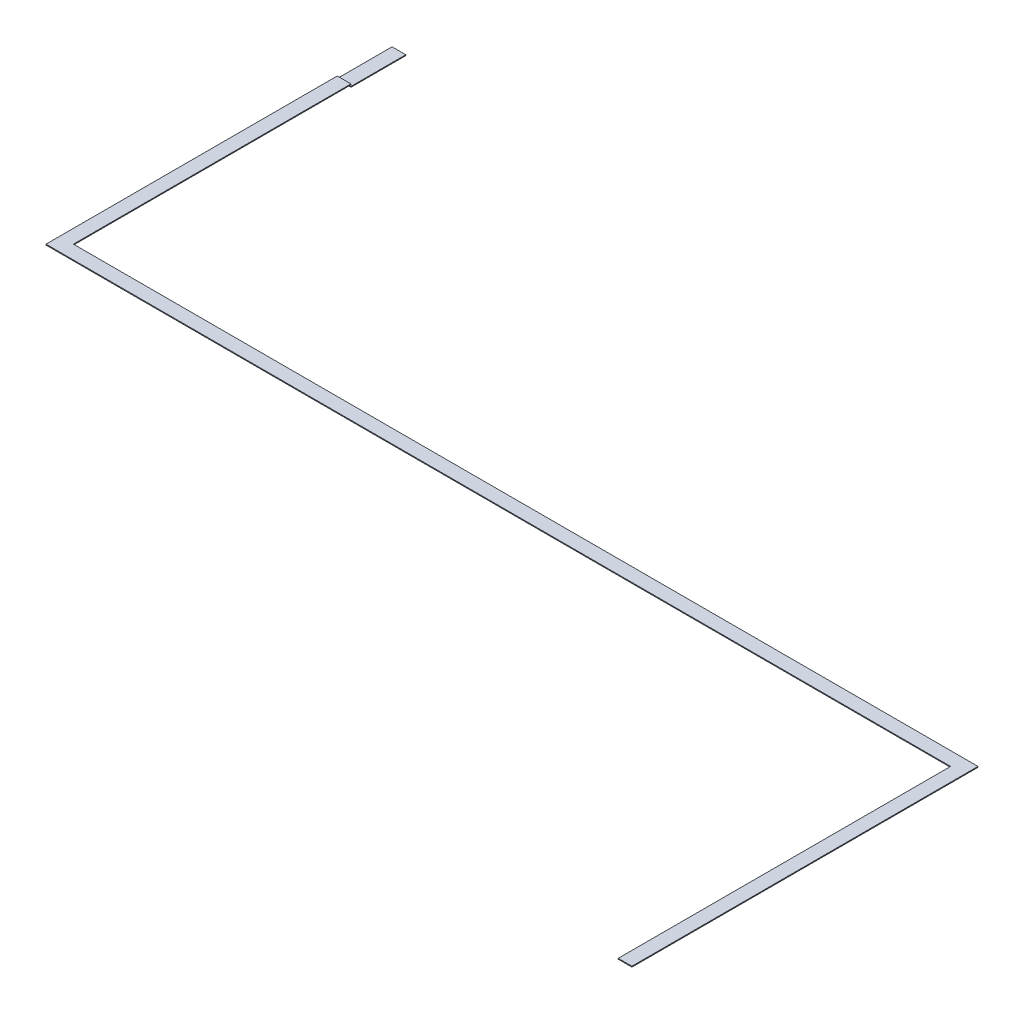
ISO-10303-21;
HEADER;
FILE_DESCRIPTION(('STEP AP214'),'2;1');
FILE_NAME('part.step','',(''),(''),'','','');
FILE_SCHEMA(('AUTOMOTIVE_DESIGN { 1 0 10303 214 1 1 1 1 }'));
ENDSEC;
DATA;
#1=APPLICATION_CONTEXT('core data for automotive mechanical design processes');
#2=APPLICATION_PROTOCOL_DEFINITION('international standard','automotive_design',2000,#1);
#3=PRODUCT_CONTEXT('',#1,'mechanical');
#4=PRODUCT('Part','Part','',(#3));
#5=PRODUCT_RELATED_PRODUCT_CATEGORY('part','',(#4));
#6=PRODUCT_DEFINITION_FORMATION('','',#4);
#7=PRODUCT_DEFINITION_CONTEXT('part definition',#1,'design');
#8=PRODUCT_DEFINITION('design','',#6,#7);
#9=PRODUCT_DEFINITION_SHAPE('','',#8);
#10=(LENGTH_UNIT() NAMED_UNIT(*) SI_UNIT(.MILLI.,.METRE.));
#11=(NAMED_UNIT(*) PLANE_ANGLE_UNIT() SI_UNIT($,.RADIAN.));
#12=(NAMED_UNIT(*) SI_UNIT($,.STERADIAN.) SOLID_ANGLE_UNIT());
#13=UNCERTAINTY_MEASURE_WITH_UNIT(LENGTH_MEASURE(1.E-05),#10,'distance_accuracy_value','');
#14=(GEOMETRIC_REPRESENTATION_CONTEXT(3) GLOBAL_UNCERTAINTY_ASSIGNED_CONTEXT((#13)) GLOBAL_UNIT_ASSIGNED_CONTEXT((#10,
#11,#12)) REPRESENTATION_CONTEXT('',''));
#15=CARTESIAN_POINT('',(0.,0.,0.));
#16=DIRECTION('',(0.,0.,1.));
#17=DIRECTION('',(1.,0.,0.));
#18=AXIS2_PLACEMENT_3D('',#15,#16,#17);
#19=CARTESIAN_POINT('',(0.,-11.1125,0.));
#20=DIRECTION('',(1.,0.,0.));
#21=DIRECTION('',(0.,0.,-1.));
#22=AXIS2_PLACEMENT_3D('',#19,#20,#21);
#23=PLANE('',#22);
#24=DIRECTION('',(0.,0.,-1.));
#25=VECTOR('',#24,1.);
#26=CARTESIAN_POINT('',(0.,-7.9375,0.));
#27=LINE('',#26,#25);
#28=CARTESIAN_POINT('',(0.,-7.9375,203.2));
#29=VERTEX_POINT('',#28);
#30=CARTESIAN_POINT('',(0.,-7.9375,0.));
#31=VERTEX_POINT('',#30);
#32=EDGE_CURVE('E110',#29,#31,#27,.T.);
#33=ORIENTED_EDGE('',*,*,#32,.T.);
#34=DIRECTION('',(0.,1.,0.));
#35=VECTOR('',#34,1.);
#36=CARTESIAN_POINT('',(0.,-11.1125,0.));
#37=LINE('',#36,#35);
#38=CARTESIAN_POINT('',(0.,-11.1125,0.));
#39=VERTEX_POINT('',#38);
#40=EDGE_CURVE('E12',#39,#31,#37,.T.);
#41=ORIENTED_EDGE('',*,*,#40,.F.);
#42=DIRECTION('',(0.,0.,-1.));
#43=VECTOR('',#42,1.);
#44=CARTESIAN_POINT('',(0.,-11.1125,0.));
#45=LINE('',#44,#43);
#46=CARTESIAN_POINT('',(0.,-11.1125,203.2));
#47=VERTEX_POINT('',#46);
#48=EDGE_CURVE('E98',#47,#39,#45,.T.);
#49=ORIENTED_EDGE('',*,*,#48,.F.);
#50=DIRECTION('',(0.,1.,0.));
#51=VECTOR('',#50,1.);
#52=CARTESIAN_POINT('',(0.,-11.1125,203.2));
#53=LINE('',#52,#51);
#54=EDGE_CURVE('E106',#47,#29,#53,.T.);
#55=ORIENTED_EDGE('',*,*,#54,.T.);
#56=EDGE_LOOP('',(#33,#41,#49,#55));
#57=FACE_BOUND('',#56,.T.);
#58=ADVANCED_FACE('F47',(#57),#23,.F.);
#59=CARTESIAN_POINT('',(0.,-11.1125,0.));
#60=DIRECTION('',(0.,0.,1.));
#61=DIRECTION('',(1.,0.,0.));
#62=AXIS2_PLACEMENT_3D('',#59,#60,#61);
#63=PLANE('',#62);
#64=DIRECTION('',(1.,0.,0.));
#65=VECTOR('',#64,1.);
#66=CARTESIAN_POINT('',(0.,-7.9375,0.));
#67=LINE('',#66,#65);
#68=CARTESIAN_POINT('',(50.7999999999997,-7.9375,0.));
#69=VERTEX_POINT('',#68);
#70=EDGE_CURVE('E102',#31,#69,#67,.T.);
#71=ORIENTED_EDGE('',*,*,#70,.T.);
#72=DIRECTION('',(0.,1.,0.));
#73=VECTOR('',#72,1.);
#74=CARTESIAN_POINT('',(50.7999999999997,-11.1125,0.));
#75=LINE('',#74,#73);
#76=CARTESIAN_POINT('',(50.7999999999997,-11.1125,0.));
#77=VERTEX_POINT('',#76);
#78=EDGE_CURVE('E55',#77,#69,#75,.T.);
#79=ORIENTED_EDGE('',*,*,#78,.F.);
#80=DIRECTION('',(1.,0.,0.));
#81=VECTOR('',#80,1.);
#82=CARTESIAN_POINT('',(0.,-11.1125,0.));
#83=LINE('',#82,#81);
#84=EDGE_CURVE('E93',#39,#77,#83,.T.);
#85=ORIENTED_EDGE('',*,*,#84,.F.);
#86=ORIENTED_EDGE('',*,*,#40,.T.);
#87=EDGE_LOOP('',(#71,#79,#85,#86));
#88=FACE_BOUND('',#87,.T.);
#89=ADVANCED_FACE('F101',(#88),#63,.F.);
#90=CARTESIAN_POINT('',(50.7999999999997,-11.1125,0.));
#91=DIRECTION('',(-1.,0.,0.));
#92=DIRECTION('',(0.,0.,1.));
#93=AXIS2_PLACEMENT_3D('',#90,#91,#92);
#94=PLANE('',#93);
#95=DIRECTION('',(0.,0.,1.));
#96=VECTOR('',#95,1.);
#97=CARTESIAN_POINT('',(50.7999999999997,-7.9375,0.));
#98=LINE('',#97,#96);
#99=CARTESIAN_POINT('',(50.7999999999997,-7.9375,203.2));
#100=VERTEX_POINT('',#99);
#101=EDGE_CURVE('E80',#69,#100,#98,.T.);
#102=ORIENTED_EDGE('',*,*,#101,.T.);
#103=DIRECTION('',(0.,1.,0.));
#104=VECTOR('',#103,1.);
#105=CARTESIAN_POINT('',(50.7999999999997,-11.1125,203.2));
#106=LINE('',#105,#104);
#107=CARTESIAN_POINT('',(50.7999999999997,-11.1125,203.2));
#108=VERTEX_POINT('',#107);
#109=EDGE_CURVE('E103',#108,#100,#106,.T.);
#110=ORIENTED_EDGE('',*,*,#109,.F.);
#111=DIRECTION('',(0.,0.,1.));
#112=VECTOR('',#111,1.);
#113=CARTESIAN_POINT('',(50.7999999999997,-11.1125,0.));
#114=LINE('',#113,#112);
#115=EDGE_CURVE('E96',#77,#108,#114,.T.);
#116=ORIENTED_EDGE('',*,*,#115,.F.);
#117=ORIENTED_EDGE('',*,*,#78,.T.);
#118=EDGE_LOOP('',(#102,#110,#116,#117));
#119=FACE_BOUND('',#118,.T.);
#120=ADVANCED_FACE('F104',(#119),#94,.F.);
#121=CARTESIAN_POINT('',(0.,-11.1125,203.2));
#122=DIRECTION('',(0.,0.,-1.));
#123=DIRECTION('',(-1.,0.,0.));
#124=AXIS2_PLACEMENT_3D('',#121,#122,#123);
#125=PLANE('',#124);
#126=DIRECTION('',(-1.,0.,0.));
#127=VECTOR('',#126,1.);
#128=CARTESIAN_POINT('',(0.,-7.9375,203.2));
#129=LINE('',#128,#127);
#130=EDGE_CURVE('E86',#100,#29,#129,.T.);
#131=ORIENTED_EDGE('',*,*,#130,.T.);
#132=ORIENTED_EDGE('',*,*,#54,.F.);
#133=DIRECTION('',(-1.,0.,0.));
#134=VECTOR('',#133,1.);
#135=CARTESIAN_POINT('',(0.,-11.1125,203.2));
#136=LINE('',#135,#134);
#137=EDGE_CURVE('E63',#108,#47,#136,.T.);
#138=ORIENTED_EDGE('',*,*,#137,.F.);
#139=ORIENTED_EDGE('',*,*,#109,.T.);
#140=EDGE_LOOP('',(#131,#132,#138,#139));
#141=FACE_BOUND('',#140,.T.);
#142=ADVANCED_FACE('F117',(#141),#125,.F.);
#143=CARTESIAN_POINT('',(0.,-11.1125,0.));
#144=DIRECTION('',(0.,1.,0.));
#145=DIRECTION('',(0.,0.,1.));
#146=AXIS2_PLACEMENT_3D('',#143,#144,#145);
#147=PLANE('',#146);
#148=ORIENTED_EDGE('',*,*,#48,.T.);
#149=ORIENTED_EDGE('',*,*,#84,.T.);
#150=ORIENTED_EDGE('',*,*,#115,.T.);
#151=ORIENTED_EDGE('',*,*,#137,.T.);
#152=EDGE_LOOP('',(#148,#149,#150,#151));
#153=FACE_BOUND('',#152,.T.);
#154=ADVANCED_FACE('F94',(#153),#147,.F.);
#155=CARTESIAN_POINT('',(0.,-7.9375,0.));
#156=DIRECTION('',(0.,1.,0.));
#157=DIRECTION('',(0.,0.,1.));
#158=AXIS2_PLACEMENT_3D('',#155,#156,#157);
#159=PLANE('',#158);
#160=ORIENTED_EDGE('',*,*,#32,.F.);
#161=ORIENTED_EDGE('',*,*,#130,.F.);
#162=ORIENTED_EDGE('',*,*,#101,.F.);
#163=ORIENTED_EDGE('',*,*,#70,.F.);
#164=EDGE_LOOP('',(#160,#161,#162,#163));
#165=FACE_BOUND('',#164,.T.);
#166=ADVANCED_FACE('F120',(#165),#159,.T.);
#167=CLOSED_SHELL('',(#58,#89,#120,#142,#154,#166));
#168=MANIFOLD_SOLID_BREP('B2',#167);
#169=CARTESIAN_POINT('',(50.7999999999997,-3.175,0.));
#170=DIRECTION('',(-1.,0.,0.));
#171=DIRECTION('',(0.,0.,1.));
#172=AXIS2_PLACEMENT_3D('',#169,#170,#171);
#173=PLANE('',#172);
#174=DIRECTION('',(0.,0.,1.));
#175=VECTOR('',#174,1.);
#176=CARTESIAN_POINT('',(50.7999999999997,-3.175,0.));
#177=LINE('',#176,#175);
#178=CARTESIAN_POINT('',(50.7999999999997,-3.175,203.2));
#179=VERTEX_POINT('',#178);
#180=CARTESIAN_POINT('',(50.8000000000002,-3.175,1231.9));
#181=VERTEX_POINT('',#180);
#182=EDGE_CURVE('E196',#179,#181,#177,.T.);
#183=ORIENTED_EDGE('',*,*,#182,.F.);
#184=DIRECTION('',(0.,-1.,0.));
#185=VECTOR('',#184,1.);
#186=CARTESIAN_POINT('',(50.7999999999997,0.,203.2));
#187=LINE('',#186,#185);
#188=CARTESIAN_POINT('',(50.7999999999997,0.,203.2));
#189=VERTEX_POINT('',#188);
#190=EDGE_CURVE('E303',#189,#179,#187,.T.);
#191=ORIENTED_EDGE('',*,*,#190,.F.);
#192=DIRECTION('',(0.,0.,1.));
#193=VECTOR('',#192,1.);
#194=CARTESIAN_POINT('',(50.7999999999997,0.,0.));
#195=LINE('',#194,#193);
#196=CARTESIAN_POINT('',(50.8000000000002,0.,1231.9));
#197=VERTEX_POINT('',#196);
#198=EDGE_CURVE('E223',#189,#197,#195,.T.);
#199=ORIENTED_EDGE('',*,*,#198,.T.);
#200=DIRECTION('',(0.,1.,0.));
#201=VECTOR('',#200,1.);
#202=CARTESIAN_POINT('',(50.8000000000002,-3.175,1231.9));
#203=LINE('',#202,#201);
#204=EDGE_CURVE('E45',#181,#197,#203,.T.);
#205=ORIENTED_EDGE('',*,*,#204,.F.);
#206=EDGE_LOOP('',(#183,#191,#199,#205));
#207=FACE_BOUND('',#206,.T.);
#208=ADVANCED_FACE('F170',(#207),#173,.F.);
#209=CARTESIAN_POINT('',(0.,-3.175,1231.9));
#210=DIRECTION('',(0.,0.,1.));
#211=DIRECTION('',(1.,0.,0.));
#212=AXIS2_PLACEMENT_3D('',#209,#210,#211);
#213=PLANE('',#212);
#214=DIRECTION('',(1.,0.,0.));
#215=VECTOR('',#214,1.);
#216=CARTESIAN_POINT('',(0.,0.,1231.9));
#217=LINE('',#216,#215);
#218=CARTESIAN_POINT('',(3403.6,0.,1231.9));
#219=VERTEX_POINT('',#218);
#220=EDGE_CURVE('E286',#197,#219,#217,.T.);
#221=ORIENTED_EDGE('',*,*,#220,.T.);
#222=DIRECTION('',(0.,1.,0.));
#223=VECTOR('',#222,1.);
#224=CARTESIAN_POINT('',(3403.6,-3.175,1231.9));
#225=LINE('',#224,#223);
#226=CARTESIAN_POINT('',(3403.6,-3.175,1231.9));
#227=VERTEX_POINT('',#226);
#228=EDGE_CURVE('E179',#227,#219,#225,.T.);
#229=ORIENTED_EDGE('',*,*,#228,.F.);
#230=DIRECTION('',(1.,0.,0.));
#231=VECTOR('',#230,1.);
#232=CARTESIAN_POINT('',(0.,-3.175,1231.9));
#233=LINE('',#232,#231);
#234=EDGE_CURVE('E250',#181,#227,#233,.T.);
#235=ORIENTED_EDGE('',*,*,#234,.F.);
#236=ORIENTED_EDGE('',*,*,#204,.T.);
#237=EDGE_LOOP('',(#221,#229,#235,#236));
#238=FACE_BOUND('',#237,.T.);
#239=ADVANCED_FACE('F313',(#238),#213,.F.);
#240=CARTESIAN_POINT('',(3403.6,-3.175,0.));
#241=DIRECTION('',(-1.,0.,0.));
#242=DIRECTION('',(0.,0.,1.));
#243=AXIS2_PLACEMENT_3D('',#240,#241,#242);
#244=PLANE('',#243);
#245=DIRECTION('',(0.,0.,1.));
#246=VECTOR('',#245,1.);
#247=CARTESIAN_POINT('',(3403.6,0.,0.));
#248=LINE('',#247,#246);
#249=CARTESIAN_POINT('',(3403.6,0.,2514.6));
#250=VERTEX_POINT('',#249);
#251=EDGE_CURVE('E259',#219,#250,#248,.T.);
#252=ORIENTED_EDGE('',*,*,#251,.T.);
#253=DIRECTION('',(0.,1.,0.));
#254=VECTOR('',#253,1.);
#255=CARTESIAN_POINT('',(3403.6,-3.175,2514.6));
#256=LINE('',#255,#254);
#257=CARTESIAN_POINT('',(3403.6,-3.175,2514.6));
#258=VERTEX_POINT('',#257);
#259=EDGE_CURVE('E256',#258,#250,#256,.T.);
#260=ORIENTED_EDGE('',*,*,#259,.F.);
#261=DIRECTION('',(0.,0.,1.));
#262=VECTOR('',#261,1.);
#263=CARTESIAN_POINT('',(3403.6,-3.175,0.));
#264=LINE('',#263,#262);
#265=EDGE_CURVE('E242',#227,#258,#264,.T.);
#266=ORIENTED_EDGE('',*,*,#265,.F.);
#267=ORIENTED_EDGE('',*,*,#228,.T.);
#268=EDGE_LOOP('',(#252,#260,#266,#267));
#269=FACE_BOUND('',#268,.T.);
#270=ADVANCED_FACE('F257',(#269),#244,.F.);
#271=CARTESIAN_POINT('',(0.,-3.175,2514.6));
#272=DIRECTION('',(0.,0.,-1.));
#273=DIRECTION('',(-1.,0.,0.));
#274=AXIS2_PLACEMENT_3D('',#271,#272,#273);
#275=PLANE('',#274);
#276=DIRECTION('',(-1.,0.,0.));
#277=VECTOR('',#276,1.);
#278=CARTESIAN_POINT('',(0.,0.,2514.6));
#279=LINE('',#278,#277);
#280=CARTESIAN_POINT('',(3352.8,0.,2514.6));
#281=VERTEX_POINT('',#280);
#282=EDGE_CURVE('E283',#250,#281,#279,.T.);
#283=ORIENTED_EDGE('',*,*,#282,.T.);
#284=DIRECTION('',(0.,1.,0.));
#285=VECTOR('',#284,1.);
#286=CARTESIAN_POINT('',(3352.8,-3.175,2514.6));
#287=LINE('',#286,#285);
#288=CARTESIAN_POINT('',(3352.8,-3.175,2514.6));
#289=VERTEX_POINT('',#288);
#290=EDGE_CURVE('E263',#289,#281,#287,.T.);
#291=ORIENTED_EDGE('',*,*,#290,.F.);
#292=DIRECTION('',(-1.,0.,0.));
#293=VECTOR('',#292,1.);
#294=CARTESIAN_POINT('',(0.,-3.175,2514.6));
#295=LINE('',#294,#293);
#296=EDGE_CURVE('E247',#258,#289,#295,.T.);
#297=ORIENTED_EDGE('',*,*,#296,.F.);
#298=ORIENTED_EDGE('',*,*,#259,.T.);
#299=EDGE_LOOP('',(#283,#291,#297,#298));
#300=FACE_BOUND('',#299,.T.);
#301=ADVANCED_FACE('F265',(#300),#275,.F.);
#302=CARTESIAN_POINT('',(3352.8,-3.175,-2.32157527525577E-12));
#303=DIRECTION('',(-1.,0.,0.));
#304=DIRECTION('',(0.,0.,1.));
#305=AXIS2_PLACEMENT_3D('',#302,#303,#304);
#306=PLANE('',#305);
#307=DIRECTION('',(0.,0.,1.));
#308=VECTOR('',#307,1.);
#309=CARTESIAN_POINT('',(3352.8,0.,-2.32157527525577E-12));
#310=LINE('',#309,#308);
#311=CARTESIAN_POINT('',(3352.8,0.,1282.7));
#312=VERTEX_POINT('',#311);
#313=EDGE_CURVE('E280',#312,#281,#310,.T.);
#314=ORIENTED_EDGE('',*,*,#313,.F.);
#315=DIRECTION('',(0.,1.,0.));
#316=VECTOR('',#315,1.);
#317=CARTESIAN_POINT('',(3352.8,-3.175,1282.7));
#318=LINE('',#317,#316);
#319=CARTESIAN_POINT('',(3352.8,-3.175,1282.7));
#320=VERTEX_POINT('',#319);
#321=EDGE_CURVE('E290',#320,#312,#318,.T.);
#322=ORIENTED_EDGE('',*,*,#321,.F.);
#323=DIRECTION('',(0.,0.,1.));
#324=VECTOR('',#323,1.);
#325=CARTESIAN_POINT('',(3352.8,-3.175,-2.32157527525577E-12));
#326=LINE('',#325,#324);
#327=EDGE_CURVE('E267',#320,#289,#326,.T.);
#328=ORIENTED_EDGE('',*,*,#327,.T.);
#329=ORIENTED_EDGE('',*,*,#290,.T.);
#330=EDGE_LOOP('',(#314,#322,#328,#329));
#331=FACE_BOUND('',#330,.T.);
#332=ADVANCED_FACE('F311',(#331),#306,.T.);
#333=CARTESIAN_POINT('',(0.,-3.175,1282.7));
#334=DIRECTION('',(0.,0.,1.));
#335=DIRECTION('',(1.,0.,0.));
#336=AXIS2_PLACEMENT_3D('',#333,#334,#335);
#337=PLANE('',#336);
#338=DIRECTION('',(1.,0.,0.));
#339=VECTOR('',#338,1.);
#340=CARTESIAN_POINT('',(0.,0.,1282.7));
#341=LINE('',#340,#339);
#342=CARTESIAN_POINT('',(0.,0.,1282.7));
#343=VERTEX_POINT('',#342);
#344=EDGE_CURVE('E277',#343,#312,#341,.T.);
#345=ORIENTED_EDGE('',*,*,#344,.F.);
#346=DIRECTION('',(0.,1.,0.));
#347=VECTOR('',#346,1.);
#348=CARTESIAN_POINT('',(0.,-3.175,1282.7));
#349=LINE('',#348,#347);
#350=CARTESIAN_POINT('',(0.,-3.175,1282.7));
#351=VERTEX_POINT('',#350);
#352=EDGE_CURVE('E174',#351,#343,#349,.T.);
#353=ORIENTED_EDGE('',*,*,#352,.F.);
#354=DIRECTION('',(1.,0.,0.));
#355=VECTOR('',#354,1.);
#356=CARTESIAN_POINT('',(0.,-3.175,1282.7));
#357=LINE('',#356,#355);
#358=EDGE_CURVE('E269',#351,#320,#357,.T.);
#359=ORIENTED_EDGE('',*,*,#358,.T.);
#360=ORIENTED_EDGE('',*,*,#321,.T.);
#361=EDGE_LOOP('',(#345,#353,#359,#360));
#362=FACE_BOUND('',#361,.T.);
#363=ADVANCED_FACE('F297',(#362),#337,.T.);
#364=CARTESIAN_POINT('',(0.,-3.175,0.));
#365=DIRECTION('',(-1.,0.,0.));
#366=DIRECTION('',(0.,0.,1.));
#367=AXIS2_PLACEMENT_3D('',#364,#365,#366);
#368=PLANE('',#367);
#369=DIRECTION('',(0.,-1.,0.));
#370=VECTOR('',#369,1.);
#371=CARTESIAN_POINT('',(0.,0.,203.2));
#372=LINE('',#371,#370);
#373=CARTESIAN_POINT('',(0.,0.,203.2));
#374=VERTEX_POINT('',#373);
#375=CARTESIAN_POINT('',(0.,-3.175,203.2));
#376=VERTEX_POINT('',#375);
#377=EDGE_CURVE('E187',#374,#376,#372,.T.);
#378=ORIENTED_EDGE('',*,*,#377,.T.);
#379=DIRECTION('',(0.,0.,1.));
#380=VECTOR('',#379,1.);
#381=CARTESIAN_POINT('',(0.,-3.175,0.));
#382=LINE('',#381,#380);
#383=EDGE_CURVE('E230',#376,#351,#382,.T.);
#384=ORIENTED_EDGE('',*,*,#383,.T.);
#385=ORIENTED_EDGE('',*,*,#352,.T.);
#386=DIRECTION('',(0.,0.,1.));
#387=VECTOR('',#386,1.);
#388=CARTESIAN_POINT('',(0.,0.,0.));
#389=LINE('',#388,#387);
#390=EDGE_CURVE('E275',#374,#343,#389,.T.);
#391=ORIENTED_EDGE('',*,*,#390,.F.);
#392=EDGE_LOOP('',(#378,#384,#385,#391));
#393=FACE_BOUND('',#392,.T.);
#394=ADVANCED_FACE('F172',(#393),#368,.T.);
#395=CARTESIAN_POINT('',(0.,-3.175,0.));
#396=DIRECTION('',(0.,1.,0.));
#397=DIRECTION('',(0.,0.,1.));
#398=AXIS2_PLACEMENT_3D('',#395,#396,#397);
#399=PLANE('',#398);
#400=ORIENTED_EDGE('',*,*,#383,.F.);
#401=DIRECTION('',(-1.,0.,0.));
#402=VECTOR('',#401,1.);
#403=CARTESIAN_POINT('',(0.,-3.175,203.2));
#404=LINE('',#403,#402);
#405=EDGE_CURVE('E304',#179,#376,#404,.T.);
#406=ORIENTED_EDGE('',*,*,#405,.F.);
#407=ORIENTED_EDGE('',*,*,#182,.T.);
#408=ORIENTED_EDGE('',*,*,#234,.T.);
#409=ORIENTED_EDGE('',*,*,#265,.T.);
#410=ORIENTED_EDGE('',*,*,#296,.T.);
#411=ORIENTED_EDGE('',*,*,#327,.F.);
#412=ORIENTED_EDGE('',*,*,#358,.F.);
#413=EDGE_LOOP('',(#400,#406,#407,#408,#409,#410,#411,#412));
#414=FACE_BOUND('',#413,.T.);
#415=ADVANCED_FACE('F244',(#414),#399,.F.);
#416=CARTESIAN_POINT('',(0.,0.,0.));
#417=DIRECTION('',(0.,1.,0.));
#418=DIRECTION('',(0.,0.,1.));
#419=AXIS2_PLACEMENT_3D('',#416,#417,#418);
#420=PLANE('',#419);
#421=DIRECTION('',(-1.,0.,0.));
#422=VECTOR('',#421,1.);
#423=CARTESIAN_POINT('',(0.,0.,203.2));
#424=LINE('',#423,#422);
#425=EDGE_CURVE('E300',#189,#374,#424,.T.);
#426=ORIENTED_EDGE('',*,*,#425,.T.);
#427=ORIENTED_EDGE('',*,*,#390,.T.);
#428=ORIENTED_EDGE('',*,*,#344,.T.);
#429=ORIENTED_EDGE('',*,*,#313,.T.);
#430=ORIENTED_EDGE('',*,*,#282,.F.);
#431=ORIENTED_EDGE('',*,*,#251,.F.);
#432=ORIENTED_EDGE('',*,*,#220,.F.);
#433=ORIENTED_EDGE('',*,*,#198,.F.);
#434=EDGE_LOOP('',(#426,#427,#428,#429,#430,#431,#432,#433));
#435=FACE_BOUND('',#434,.T.);
#436=ADVANCED_FACE('F299',(#435),#420,.T.);
#437=CARTESIAN_POINT('',(0.,0.,203.2));
#438=DIRECTION('',(0.,0.,1.));
#439=DIRECTION('',(1.,0.,0.));
#440=AXIS2_PLACEMENT_3D('',#437,#438,#439);
#441=PLANE('',#440);
#442=ORIENTED_EDGE('',*,*,#405,.T.);
#443=ORIENTED_EDGE('',*,*,#377,.F.);
#444=ORIENTED_EDGE('',*,*,#425,.F.);
#445=ORIENTED_EDGE('',*,*,#190,.T.);
#446=EDGE_LOOP('',(#442,#443,#444,#445));
#447=FACE_BOUND('',#446,.T.);
#448=ADVANCED_FACE('F316',(#447),#441,.F.);
#449=CLOSED_SHELL('',(#208,#239,#270,#301,#332,#363,#394,#415,#436,#448));
#450=MANIFOLD_SOLID_BREP('B6',#449);
#451=ADVANCED_BREP_SHAPE_REPRESENTATION('',(#18,#168,#450),#14);
#452=SHAPE_DEFINITION_REPRESENTATION(#9,#451);
ENDSEC;
END-ISO-10303-21;
